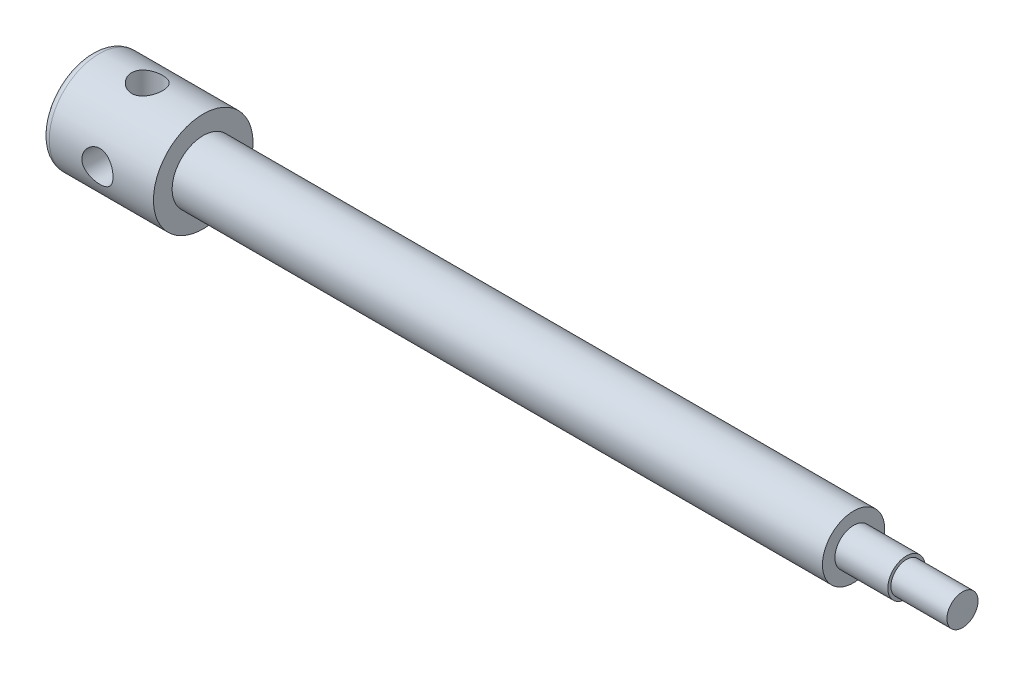
ISO-10303-21;
HEADER;
FILE_DESCRIPTION(('STEP AP214'),'2;1');
FILE_NAME('part.step','',(''),(''),'','','');
FILE_SCHEMA(('AUTOMOTIVE_DESIGN { 1 0 10303 214 1 1 1 1 }'));
ENDSEC;
DATA;
#1=APPLICATION_CONTEXT('core data for automotive mechanical design processes');
#2=APPLICATION_PROTOCOL_DEFINITION('international standard','automotive_design',2000,#1);
#3=PRODUCT_CONTEXT('',#1,'mechanical');
#4=PRODUCT('Part','Part','',(#3));
#5=PRODUCT_RELATED_PRODUCT_CATEGORY('part','',(#4));
#6=PRODUCT_DEFINITION_FORMATION('','',#4);
#7=PRODUCT_DEFINITION_CONTEXT('part definition',#1,'design');
#8=PRODUCT_DEFINITION('design','',#6,#7);
#9=PRODUCT_DEFINITION_SHAPE('','',#8);
#10=(LENGTH_UNIT() NAMED_UNIT(*) SI_UNIT(.MILLI.,.METRE.));
#11=(NAMED_UNIT(*) PLANE_ANGLE_UNIT() SI_UNIT($,.RADIAN.));
#12=(NAMED_UNIT(*) SI_UNIT($,.STERADIAN.) SOLID_ANGLE_UNIT());
#13=UNCERTAINTY_MEASURE_WITH_UNIT(LENGTH_MEASURE(1.E-05),#10,'distance_accuracy_value','');
#14=(GEOMETRIC_REPRESENTATION_CONTEXT(3) GLOBAL_UNCERTAINTY_ASSIGNED_CONTEXT((#13)) GLOBAL_UNIT_ASSIGNED_CONTEXT((#10,
#11,#12)) REPRESENTATION_CONTEXT('',''));
#15=CARTESIAN_POINT('',(0.,0.,0.));
#16=DIRECTION('',(0.,0.,1.));
#17=DIRECTION('',(1.,0.,0.));
#18=AXIS2_PLACEMENT_3D('',#15,#16,#17);
#19=CARTESIAN_POINT('',(-71.92624784853,0.,-20.));
#20=DIRECTION('',(0.,0.,1.));
#21=DIRECTION('',(1.,0.,0.));
#22=AXIS2_PLACEMENT_3D('',#19,#20,#21);
#23=CYLINDRICAL_SURFACE('',#22,5.);
#24=CARTESIAN_POINT('',(-66.92624784853,0.,16.));
#25=CARTESIAN_POINT('',(-66.9262496348803,-0.273756740698178,15.9999986351195));
#26=CARTESIAN_POINT('',(-66.9488047563077,-0.547532210011409,15.9929077993933));
#27=CARTESIAN_POINT('',(-67.038192814687,-1.08707683835382,15.9653157635526));
#28=CARTESIAN_POINT('',(-67.1050357739876,-1.35284417090373,15.9448115279957));
#29=CARTESIAN_POINT('',(-67.2805253333128,-1.86851417460312,15.892632627915));
#30=CARTESIAN_POINT('',(-67.3891072271413,-2.11844070794284,15.860975259956));
#31=CARTESIAN_POINT('',(-67.6447171192438,-2.59653920938621,15.7897587664487));
#32=CARTESIAN_POINT('',(-67.7917511756543,-2.82470774178094,15.7501983960149));
#33=CARTESIAN_POINT('',(-68.1248718165974,-3.25986133980768,15.6660085495921));
#34=CARTESIAN_POINT('',(-68.3119313887667,-3.46608011262119,15.621268637007));
#35=CARTESIAN_POINT('',(-68.7177214181918,-3.84478952815342,15.5324018550409));
#36=CARTESIAN_POINT('',(-68.9364577585365,-4.01727389161515,15.4882751012093));
#37=CARTESIAN_POINT('',(-69.4060261037373,-4.32777345930637,15.4044457876485));
#38=CARTESIAN_POINT('',(-69.6575177585377,-4.4648313659311,15.3648795310221));
#39=CARTESIAN_POINT('',(-70.1814171083526,-4.69438964299239,15.2963120709366));
#40=CARTESIAN_POINT('',(-70.4538192716734,-4.78690175085854,15.2673080849026));
#41=CARTESIAN_POINT('',(-71.0031601583637,-4.92193839721857,15.224304279618));
#42=CARTESIAN_POINT('',(-71.2797152230982,-4.96588440031619,15.2098789171452));
#43=CARTESIAN_POINT('',(-71.8366203241648,-5.00698220147794,15.1964022056731));
#44=CARTESIAN_POINT('',(-72.116969331791,-5.00414643984172,15.1973467694717));
#45=CARTESIAN_POINT('',(-72.6617456896411,-4.95287298929817,15.2141275626545));
#46=CARTESIAN_POINT('',(-72.9263643520819,-4.90624231472935,15.2293736684469));
#47=CARTESIAN_POINT('',(-73.443816474779,-4.77163253417961,15.272081024701));
#48=CARTESIAN_POINT('',(-73.6966486793883,-4.68364903377187,15.2995435733467));
#49=CARTESIAN_POINT('',(-74.1876556262284,-4.46755498726522,15.3640417609541));
#50=CARTESIAN_POINT('',(-74.4255622912893,-4.33887702648707,15.4012113865356));
#51=CARTESIAN_POINT('',(-74.8769989200551,-4.04544082951014,15.4808742631002));
#52=CARTESIAN_POINT('',(-75.0905225295472,-3.88067322086206,15.523368895754));
#53=CARTESIAN_POINT('',(-75.4973476221955,-3.51086781672959,15.6112611120491));
#54=CARTESIAN_POINT('',(-75.6892860796481,-3.30433828237157,15.6567027842357));
#55=CARTESIAN_POINT('',(-76.0361354228494,-2.86145763238184,15.7436628303753));
#56=CARTESIAN_POINT('',(-76.191043565407,-2.62510430939601,15.7851809135328));
#57=CARTESIAN_POINT('',(-76.4603586029349,-2.1266584418619,15.8600517956098));
#58=CARTESIAN_POINT('',(-76.5744403903858,-1.86437962767715,15.8933384259289));
#59=CARTESIAN_POINT('',(-76.7564598519363,-1.32307191113056,15.9475182331416));
#60=CARTESIAN_POINT('',(-76.8244115374836,-1.04404812289843,15.9684151730059));
#61=CARTESIAN_POINT('',(-76.9099200188459,-0.488740629161391,15.9948555758007));
#62=CARTESIAN_POINT('',(-76.9293220229041,-0.212767395155379,16.0009609158175));
#63=CARTESIAN_POINT('',(-76.9223829419807,0.338521222930341,15.9987919892393));
#64=CARTESIAN_POINT('',(-76.8960485392395,0.613836697226033,15.9905198232454));
#65=CARTESIAN_POINT('',(-76.7998654781044,1.14887733190339,15.9608945507905));
#66=CARTESIAN_POINT('',(-76.73111477808,1.40881991368374,15.9398717244275));
#67=CARTESIAN_POINT('',(-76.5533904390631,1.9134077154455,15.8872048551716));
#68=CARTESIAN_POINT('',(-76.4444118324299,2.15805104179623,15.8555595005738));
#69=CARTESIAN_POINT('',(-76.1863549823352,2.63172962668875,15.783941710377));
#70=CARTESIAN_POINT('',(-76.0363638985427,2.86023895915116,15.7437850727067));
#71=CARTESIAN_POINT('',(-75.7016350080603,3.28946340384103,15.6597364001372));
#72=CARTESIAN_POINT('',(-75.5168877775514,3.49017095217579,15.6158433539155));
#73=CARTESIAN_POINT('',(-75.1092122883216,3.86634985167607,15.5270797953257));
#74=CARTESIAN_POINT('',(-74.8850611935731,4.04050609358125,15.4822394682577));
#75=CARTESIAN_POINT('',(-74.4097413830229,4.34885000980606,15.3984778838242));
#76=CARTESIAN_POINT('',(-74.158573096422,4.48303831893719,15.3595565324524));
#77=CARTESIAN_POINT('',(-73.6368671570481,4.70680333922169,15.2924712932348));
#78=CARTESIAN_POINT('',(-73.3664092507871,4.7965527822405,15.264265854275));
#79=CARTESIAN_POINT('',(-72.8131578755355,4.92891577272361,15.2220468337724));
#80=CARTESIAN_POINT('',(-72.5303691431559,4.97154725655978,15.2080278520491));
#81=CARTESIAN_POINT('',(-71.9742314982083,5.00717624632503,15.1963317085551));
#82=CARTESIAN_POINT('',(-71.7010340331403,5.00233118486543,15.1979441840057));
#83=CARTESIAN_POINT('',(-71.1595495087622,4.94835272515336,15.2156036150361));
#84=CARTESIAN_POINT('',(-70.891262220983,4.89922139290049,15.2316498972642));
#85=CARTESIAN_POINT('',(-70.3710716901624,4.7595091965447,15.2758725673356));
#86=CARTESIAN_POINT('',(-70.1189860841565,4.66954569624033,15.3038679276103));
#87=CARTESIAN_POINT('',(-69.6332861943939,4.45120909339998,15.3687881701826));
#88=CARTESIAN_POINT('',(-69.3996756802163,4.32282817776947,15.4057148685869));
#89=CARTESIAN_POINT('',(-68.9476639667707,4.02542700053974,15.4861394813401));
#90=CARTESIAN_POINT('',(-68.730215330529,3.8550133409653,15.5298379569183));
#91=CARTESIAN_POINT('',(-68.326302536082,3.48083598561921,15.6179599528484));
#92=CARTESIAN_POINT('',(-68.1398466925657,3.27706336937757,15.6623836642662));
#93=CARTESIAN_POINT('',(-67.7971176950783,2.8339466512934,15.7486908780989));
#94=CARTESIAN_POINT('',(-67.6420289027302,2.59365829794955,15.7904440692269));
#95=CARTESIAN_POINT('',(-67.3746521879722,2.08911655205461,15.8650707718751));
#96=CARTESIAN_POINT('',(-67.2623474399626,1.8248726311818,15.8979477726329));
#97=CARTESIAN_POINT('',(-67.0918823780961,1.30299054149592,15.9488260293388));
#98=CARTESIAN_POINT('',(-67.0299483793086,1.04668134845019,15.9678496322456));
#99=CARTESIAN_POINT('',(-66.9471344086591,0.52691958176099,15.9934360136194));
#100=CARTESIAN_POINT('',(-66.926246129314,0.263468464558693,16.0000013135858));
#101=CARTESIAN_POINT('',(-66.92624784853,0.,16.));
#102=B_SPLINE_CURVE_WITH_KNOTS('',3,(#24,#25,#26,#27,#28,#29,#30,#31,#32,#33,#34,#35,#36,#37,
#38,#39,#40,#41,#42,#43,#44,#45,#46,#47,#48,#49,#50,#51,#52,#53,#54,#55,#56,#57,#58,#59,#60,#61,
#62,#63,#64,#65,#66,#67,#68,#69,#70,#71,#72,#73,#74,#75,#76,#77,#78,#79,#80,#81,#82,#83,#84,#85,
#86,#87,#88,#89,#90,#91,#92,#93,#94,#95,#96,#97,#98,#99,#100,#101),.UNSPECIFIED.,.T.,.F.,(4,2,2,
2,2,2,2,2,2,2,2,2,2,2,2,2,2,2,2,2,2,2,2,2,2,2,2,2,2,2,2,2,2,2,2,2,2,2,4),(0.,0.820301797730038,
1.64078929339627,2.46000991680974,3.27935968623356,4.12151288780634,4.96382269725105,
5.82695084991453,6.68985145121465,7.52676600672196,8.3634580118391,9.16707669695196,
9.97078079925602,10.7862257089153,11.6018826405078,12.4546698912775,13.3075202966256,
14.1670184276843,15.0262553798757,15.852302742023,16.678229426068,17.4836250690084,
18.2891202014735,19.1142529896272,19.9396098284639,20.7976711486191,21.655718839442,
22.5104046302277,23.3647649559871,24.1804881394267,24.9961732705188,25.7999165363423,
26.6038233736824,27.4391805607299,28.274761495409,29.1376267255319,30.0001522671289,
30.7897854665371,31.5792588309973),.UNSPECIFIED.);
#103=CARTESIAN_POINT('',(-66.92624784853,0.,16.));
#104=VERTEX_POINT('',#103);
#105=EDGE_CURVE('E64',#104,#104,#102,.T.);
#106=ORIENTED_EDGE('',*,*,#105,.F.);
#107=EDGE_LOOP('',(#106));
#108=FACE_BOUND('',#107,.T.);
#109=CARTESIAN_POINT('',(-71.92624784853,0.,0.));
#110=DIRECTION('',(0.,-0.707106781186547,0.707106781186547));
#111=DIRECTION('',(0.,0.707106781186547,0.707106781186547));
#112=AXIS2_PLACEMENT_3D('',#109,#110,#111);
#113=ELLIPSE('',#112,7.07106781186548,5.);
#114=CARTESIAN_POINT('',(-76.92624784853,0.,0.));
#115=VERTEX_POINT('',#114);
#116=CARTESIAN_POINT('',(-66.92624784853,0.,0.));
#117=VERTEX_POINT('',#116);
#118=EDGE_CURVE('E44',#115,#117,#113,.F.);
#119=ORIENTED_EDGE('',*,*,#118,.T.);
#120=CARTESIAN_POINT('',(-71.92624784853,0.,0.));
#121=DIRECTION('',(0.,0.707106781186547,0.707106781186547));
#122=DIRECTION('',(0.,-0.707106781186547,0.707106781186547));
#123=AXIS2_PLACEMENT_3D('',#120,#121,#122);
#124=ELLIPSE('',#123,7.07106781186548,5.);
#125=EDGE_CURVE('E11',#117,#115,#124,.F.);
#126=ORIENTED_EDGE('',*,*,#125,.T.);
#127=EDGE_LOOP('',(#119,#126));
#128=FACE_BOUND('',#127,.T.);
#129=ADVANCED_FACE('F31',(#108,#128),#23,.F.);
#130=CARTESIAN_POINT('',(-89.92624784853,0.,0.));
#131=DIRECTION('',(1.,0.,0.));
#132=DIRECTION('',(0.,0.,-1.));
#133=AXIS2_PLACEMENT_3D('',#130,#131,#132);
#134=PLANE('',#133);
#135=CARTESIAN_POINT('',(-89.92624784853,0.,0.));
#136=DIRECTION('',(-1.,0.,0.));
#137=DIRECTION('',(0.,0.,1.));
#138=AXIS2_PLACEMENT_3D('',#135,#136,#137);
#139=CIRCLE('',#138,13.5);
#140=CARTESIAN_POINT('',(-89.92624784853,0.,13.5));
#141=VERTEX_POINT('',#140);
#142=EDGE_CURVE('E59',#141,#141,#139,.T.);
#143=ORIENTED_EDGE('',*,*,#142,.T.);
#144=EDGE_LOOP('',(#143));
#145=FACE_BOUND('',#144,.T.);
#146=ADVANCED_FACE('F33',(#145),#134,.F.);
#147=CARTESIAN_POINT('',(-87.42624784853,0.,0.));
#148=DIRECTION('',(-1.,0.,0.));
#149=DIRECTION('',(0.,0.,1.));
#150=AXIS2_PLACEMENT_3D('',#147,#148,#149);
#151=TOROIDAL_SURFACE('',#150,13.5,2.50000000000001);
#152=ORIENTED_EDGE('',*,*,#142,.F.);
#153=EDGE_LOOP('',(#152));
#154=FACE_BOUND('',#153,.T.);
#155=CARTESIAN_POINT('',(-87.42624784853,0.,0.));
#156=DIRECTION('',(-1.,0.,0.));
#157=DIRECTION('',(0.,0.,1.));
#158=AXIS2_PLACEMENT_3D('',#155,#156,#157);
#159=CIRCLE('',#158,16.);
#160=CARTESIAN_POINT('',(-87.42624784853,0.,16.));
#161=VERTEX_POINT('',#160);
#162=EDGE_CURVE('E133',#161,#161,#159,.T.);
#163=ORIENTED_EDGE('',*,*,#162,.T.);
#164=EDGE_LOOP('',(#163));
#165=FACE_BOUND('',#164,.T.);
#166=ADVANCED_FACE('F114',(#154,#165),#151,.T.);
#167=CARTESIAN_POINT('',(0.,0.,0.));
#168=DIRECTION('',(-1.,0.,0.));
#169=DIRECTION('',(0.,0.,1.));
#170=AXIS2_PLACEMENT_3D('',#167,#168,#169);
#171=CYLINDRICAL_SURFACE('',#170,16.);
#172=CARTESIAN_POINT('',(-71.92624784853,-15.1986841535707,5.));
#173=CARTESIAN_POINT('',(-71.6528597040784,-15.1986858388479,4.99999815120853));
#174=CARTESIAN_POINT('',(-71.3794527737134,-15.206141260301,4.97750155166157));
#175=CARTESIAN_POINT('',(-70.8406712050226,-15.2350255598558,4.8883670160513));
#176=CARTESIAN_POINT('',(-70.5752987576024,-15.2564582140989,4.82171715130013));
#177=CARTESIAN_POINT('',(-70.060468240801,-15.3106375534649,4.64679152894284));
#178=CARTESIAN_POINT('',(-69.810982916107,-15.3433642077798,4.53858942946721));
#179=CARTESIAN_POINT('',(-69.3336370650742,-15.4164162487404,4.28387656692615));
#180=CARTESIAN_POINT('',(-69.1057803686896,-15.4567429774317,4.13735903622525));
#181=CARTESIAN_POINT('',(-68.670332378556,-15.5420051067468,3.80478428248921));
#182=CARTESIAN_POINT('',(-68.463593410786,-15.5870449353918,3.61763759888161));
#183=CARTESIAN_POINT('',(-68.0838637956932,-15.6757698344129,3.21144818582197));
#184=CARTESIAN_POINT('',(-67.9108778607506,-15.7194547149049,2.99240101007426));
#185=CARTESIAN_POINT('',(-67.599803596485,-15.8017421356033,2.52250364997345));
#186=CARTESIAN_POINT('',(-67.4625930332041,-15.8402073825112,2.27104622608038));
#187=CARTESIAN_POINT('',(-67.2327436491078,-15.9065020733207,1.74721693141361));
#188=CARTESIAN_POINT('',(-67.1400943519316,-15.9343340167968,1.47484999394821));
#189=CARTESIAN_POINT('',(-67.0048433361417,-15.9754870328345,0.925857427864398));
#190=CARTESIAN_POINT('',(-66.9607848493786,-15.9892295593657,0.649622861872868));
#191=CARTESIAN_POINT('',(-66.9193504627799,-16.0021438350407,0.0933632559380788));
#192=CARTESIAN_POINT('',(-66.9219639510947,-16.0013188964028,-0.186660907892346));
#193=CARTESIAN_POINT('',(-66.9728410148738,-15.9854846453013,-0.732297921418927));
#194=CARTESIAN_POINT('',(-67.019525382582,-15.9709660388855,-0.998074537256131));
#195=CARTESIAN_POINT('',(-67.1546278087021,-15.929979302435,-1.51781225339112));
#196=CARTESIAN_POINT('',(-67.2430485888765,-15.9035103930884,-1.77177258192494));
#197=CARTESIAN_POINT('',(-67.4601286048292,-15.8409383891783,-2.26431241261896));
#198=CARTESIAN_POINT('',(-67.589267082781,-15.8047213446668,-2.50266562249071));
#199=CARTESIAN_POINT('',(-67.8837322473493,-15.7264689181539,-2.95481004460873));
#200=CARTESIAN_POINT('',(-68.0490680850855,-15.6844320658262,-3.16859502483764));
#201=CARTESIAN_POINT('',(-68.4193423877308,-15.5969468293413,-3.57495079381314));
#202=CARTESIAN_POINT('',(-68.6256441238783,-15.5514292793937,-3.76626619636764));
#203=CARTESIAN_POINT('',(-69.0678282558442,-15.4636246177862,-4.11195897039057));
#204=CARTESIAN_POINT('',(-69.3037141308914,-15.4213378870279,-4.26633199104755));
#205=CARTESIAN_POINT('',(-69.8019177239203,-15.3444338653158,-4.53521860076338));
#206=CARTESIAN_POINT('',(-70.0645014844939,-15.3099076117639,-4.64926722799055));
#207=CARTESIAN_POINT('',(-70.606485815898,-15.253501811154,-4.83113383782183));
#208=CARTESIAN_POINT('',(-70.8858803053075,-15.2316177207005,-4.89896843060006));
#209=CARTESIAN_POINT('',(-71.4415276588385,-15.2039825362816,-4.9840594074562));
#210=CARTESIAN_POINT('',(-71.7174558334705,-15.1976186557503,-5.00323817415589));
#211=CARTESIAN_POINT('',(-72.2686068145105,-15.200043098397,-4.99586977992484));
#212=CARTESIAN_POINT('',(-72.5438297233287,-15.2088290802927,-4.96932968445627));
#213=CARTESIAN_POINT('',(-73.0774810351397,-15.2399582993567,-4.87299494052765));
#214=CARTESIAN_POINT('',(-73.3361649448268,-15.2619021640804,-4.80447324642202));
#215=CARTESIAN_POINT('',(-73.8383350165133,-15.3164514932552,-4.62761494644059));
#216=CARTESIAN_POINT('',(-74.0818186922145,-15.3490586964925,-4.51927184684605));
#217=CARTESIAN_POINT('',(-74.5544042876172,-15.4224215861294,-4.26230042623513));
#218=CARTESIAN_POINT('',(-74.7828935109011,-15.4633841395902,-4.11260589954234));
#219=CARTESIAN_POINT('',(-75.2122092339776,-15.5484139589123,-3.77842563471921));
#220=CARTESIAN_POINT('',(-75.4130285242313,-15.5924820294279,-3.59393085876313));
#221=CARTESIAN_POINT('',(-75.7898893121813,-15.6809675025074,-3.18629179101443));
#222=CARTESIAN_POINT('',(-75.9645589930895,-15.7253236914272,-2.96186259915408));
#223=CARTESIAN_POINT('',(-76.273812021815,-15.8075623937471,-2.48580618260558));
#224=CARTESIAN_POINT('',(-76.4083972057741,-15.8454452036378,-2.23418020443448));
#225=CARTESIAN_POINT('',(-76.6323700984167,-15.9102524771405,-1.71242209332732));
#226=CARTESIAN_POINT('',(-76.7220849999047,-15.937255982448,-1.44244073713502));
#227=CARTESIAN_POINT('',(-76.8545380028888,-15.9776097059431,-0.890229016225553));
#228=CARTESIAN_POINT('',(-76.8972908048639,-15.9909641965712,-0.608002513361415));
#229=CARTESIAN_POINT('',(-76.9334118555285,-16.0022321361783,-0.051939746595608));
#230=CARTESIAN_POINT('',(-76.9287616492131,-16.0007651762951,0.221756767786049));
#231=CARTESIAN_POINT('',(-76.8750006043352,-15.9840391232424,0.764292887693026));
#232=CARTESIAN_POINT('',(-76.825892664562,-15.9687809293064,1.03313280871841));
#233=CARTESIAN_POINT('',(-76.6858718116411,-15.9263828337902,1.55502047392303));
#234=CARTESIAN_POINT('',(-76.5954894171492,-15.899393918402,1.80822367379742));
#235=CARTESIAN_POINT('',(-76.3759645396954,-15.8363178235242,2.29599370200086));
#236=CARTESIAN_POINT('',(-76.2468154086338,-15.8002290836774,2.53055732509979));
#237=CARTESIAN_POINT('',(-75.9483568151548,-15.7211958753111,2.98304677987683));
#238=CARTESIAN_POINT('',(-75.777833758684,-15.6780603899479,3.20013842820514));
#239=CARTESIAN_POINT('',(-75.4036082907463,-15.590349461973,3.6032831656046));
#240=CARTESIAN_POINT('',(-75.1998959519356,-15.5457735917315,3.78932693404399));
#241=CARTESIAN_POINT('',(-74.7569849692002,-15.4584757027472,4.13131463642454));
#242=CARTESIAN_POINT('',(-74.5168342362006,-15.4158640332118,4.28605711968616));
#243=CARTESIAN_POINT('',(-74.0126553675799,-15.3392050100618,4.5528188298417));
#244=CARTESIAN_POINT('',(-73.7486369427427,-15.3051541945183,4.66485533612217));
#245=CARTESIAN_POINT('',(-73.2273573792551,-15.2522624175552,4.83484721745086));
#246=CARTESIAN_POINT('',(-72.9714376587741,-15.2323726005924,4.89659759350261));
#247=CARTESIAN_POINT('',(-72.4524325202143,-15.2055842579893,4.97916983261894));
#248=CARTESIAN_POINT('',(-72.1893488837477,-15.1986825317074,5.00000177922474));
#249=CARTESIAN_POINT('',(-71.92624784853,-15.1986841535707,5.));
#250=B_SPLINE_CURVE_WITH_KNOTS('',3,(#172,#173,#174,#175,#176,#177,#178,#179,#180,#181,#182,
#183,#184,#185,#186,#187,#188,#189,#190,#191,#192,#193,#194,#195,#196,#197,#198,#199,#200,#201,
#202,#203,#204,#205,#206,#207,#208,#209,#210,#211,#212,#213,#214,#215,#216,#217,#218,#219,#220,
#221,#222,#223,#224,#225,#226,#227,#228,#229,#230,#231,#232,#233,#234,#235,#236,#237,#238,#239,
#240,#241,#242,#243,#244,#245,#246,#247,#248,#249),.UNSPECIFIED.,.T.,.F.,(4,2,2,2,2,2,2,2,2,2,2,
2,2,2,2,2,2,2,2,2,2,2,2,2,2,2,2,2,2,2,2,2,2,2,2,2,2,2,4),(0.,0.819192550193962,1.63860650823894,
2.45657457647432,3.27468721969979,4.11828322203354,4.96199691764492,5.82479287854934,
6.68738589671688,7.52334891342135,8.35912185887099,9.16603931879003,9.97300940760373,
10.7898561843364,11.6069097085275,12.4580135574934,13.3092175941511,14.1699388374229,
15.0303505582074,15.8561973316147,16.6819164888609,17.4837588818718,18.2857320902257,
19.1107045324817,19.9358915205725,20.7952775125578,21.6546241327808,22.5076095717372,
23.3603279257207,24.1775520976783,24.9947229877896,25.8016738606877,26.6087631965634,
27.4432277243059,28.2779423109849,29.1403118201788,30.002332032282,30.7908941750129,
31.5792619677388),.UNSPECIFIED.);
#251=CARTESIAN_POINT('',(-71.92624784853,-15.1986841535707,5.));
#252=VERTEX_POINT('',#251);
#253=EDGE_CURVE('E243',#252,#252,#250,.T.);
#254=ORIENTED_EDGE('',*,*,#253,.T.);
#255=EDGE_LOOP('',(#254));
#256=FACE_BOUND('',#255,.T.);
#257=CARTESIAN_POINT('',(-71.92624784853,15.1986841535707,5.));
#258=CARTESIAN_POINT('',(-72.1996359929815,15.1986858388479,4.99999815120853));
#259=CARTESIAN_POINT('',(-72.4730429233466,15.206141260301,4.97750155166157));
#260=CARTESIAN_POINT('',(-73.0118244920374,15.2350255598558,4.8883670160513));
#261=CARTESIAN_POINT('',(-73.2771969394576,15.2564582140989,4.82171715130013));
#262=CARTESIAN_POINT('',(-73.792027456259,15.3106375534649,4.64679152894284));
#263=CARTESIAN_POINT('',(-74.041512780953,15.3433642077798,4.53858942946721));
#264=CARTESIAN_POINT('',(-74.5188586319858,15.4164162487404,4.28387656692615));
#265=CARTESIAN_POINT('',(-74.7467153283704,15.4567429774317,4.13735903622525));
#266=CARTESIAN_POINT('',(-75.182163318504,15.5420051067468,3.80478428248921));
#267=CARTESIAN_POINT('',(-75.3889022862739,15.5870449353918,3.61763759888161));
#268=CARTESIAN_POINT('',(-75.7686319013667,15.6757698344129,3.21144818582197));
#269=CARTESIAN_POINT('',(-75.9416178363094,15.7194547149049,2.99240101007426));
#270=CARTESIAN_POINT('',(-76.252692100575,15.8017421356033,2.52250364997345));
#271=CARTESIAN_POINT('',(-76.3899026638558,15.8402073825112,2.27104622608038));
#272=CARTESIAN_POINT('',(-76.6197520479522,15.9065020733207,1.74721693141362));
#273=CARTESIAN_POINT('',(-76.7124013451283,15.9343340167968,1.47484999394821));
#274=CARTESIAN_POINT('',(-76.8476523609183,15.9754870328345,0.925857427864399));
#275=CARTESIAN_POINT('',(-76.8917108476814,15.9892295593657,0.64962286187287));
#276=CARTESIAN_POINT('',(-76.9331452342801,16.0021438350407,0.0933632559380811));
#277=CARTESIAN_POINT('',(-76.9305317459653,16.0013188964028,-0.186660907892345));
#278=CARTESIAN_POINT('',(-76.8796546821862,15.9854846453013,-0.732297921418927));
#279=CARTESIAN_POINT('',(-76.832970314478,15.9709660388855,-0.998074537256131));
#280=CARTESIAN_POINT('',(-76.6978678883579,15.929979302435,-1.51781225339112));
#281=CARTESIAN_POINT('',(-76.6094471081835,15.9035103930884,-1.77177258192494));
#282=CARTESIAN_POINT('',(-76.3923670922308,15.8409383891783,-2.26431241261896));
#283=CARTESIAN_POINT('',(-76.263228614279,15.8047213446668,-2.50266562249071));
#284=CARTESIAN_POINT('',(-75.9687634497106,15.7264689181539,-2.95481004460873));
#285=CARTESIAN_POINT('',(-75.8034276119745,15.6844320658262,-3.16859502483764));
#286=CARTESIAN_POINT('',(-75.4331533093291,15.5969468293413,-3.57495079381314));
#287=CARTESIAN_POINT('',(-75.2268515731816,15.5514292793937,-3.76626619636765));
#288=CARTESIAN_POINT('',(-74.7846674412157,15.4636246177862,-4.11195897039057));
#289=CARTESIAN_POINT('',(-74.5487815661686,15.4213378870279,-4.26633199104755));
#290=CARTESIAN_POINT('',(-74.0505779731397,15.3444338653158,-4.53521860076338));
#291=CARTESIAN_POINT('',(-73.7879942125661,15.3099076117639,-4.64926722799055));
#292=CARTESIAN_POINT('',(-73.246009881162,15.253501811154,-4.83113383782183));
#293=CARTESIAN_POINT('',(-72.9666153917525,15.2316177207005,-4.89896843060006));
#294=CARTESIAN_POINT('',(-72.4109680382214,15.2039825362816,-4.9840594074562));
#295=CARTESIAN_POINT('',(-72.1350398635894,15.1976186557503,-5.00323817415589));
#296=CARTESIAN_POINT('',(-71.5838888825494,15.200043098397,-4.99586977992484));
#297=CARTESIAN_POINT('',(-71.3086659737313,15.2088290802927,-4.96932968445627));
#298=CARTESIAN_POINT('',(-70.7750146619203,15.2399582993567,-4.87299494052765));
#299=CARTESIAN_POINT('',(-70.5163307522332,15.2619021640804,-4.80447324642202));
#300=CARTESIAN_POINT('',(-70.0141606805466,15.3164514932552,-4.62761494644059));
#301=CARTESIAN_POINT('',(-69.7706770048455,15.3490586964925,-4.51927184684605));
#302=CARTESIAN_POINT('',(-69.2980914094427,15.4224215861294,-4.26230042623513));
#303=CARTESIAN_POINT('',(-69.0696021861588,15.4633841395902,-4.11260589954233));
#304=CARTESIAN_POINT('',(-68.6402864630824,15.5484139589123,-3.77842563471921));
#305=CARTESIAN_POINT('',(-68.4394671728286,15.5924820294279,-3.59393085876312));
#306=CARTESIAN_POINT('',(-68.0626063848787,15.6809675025074,-3.18629179101443));
#307=CARTESIAN_POINT('',(-67.8879367039705,15.7253236914272,-2.96186259915408));
#308=CARTESIAN_POINT('',(-67.5786836752449,15.8075623937471,-2.48580618260558));
#309=CARTESIAN_POINT('',(-67.4440984912858,15.8454452036378,-2.23418020443448));
#310=CARTESIAN_POINT('',(-67.2201255986432,15.9102524771405,-1.71242209332732));
#311=CARTESIAN_POINT('',(-67.1304106971552,15.937255982448,-1.44244073713502));
#312=CARTESIAN_POINT('',(-66.9979576941711,15.9776097059431,-0.890229016225556));
#313=CARTESIAN_POINT('',(-66.955204892196,15.9909641965712,-0.608002513361416));
#314=CARTESIAN_POINT('',(-66.9190838415315,16.0022321361783,-0.0519397465956069));
#315=CARTESIAN_POINT('',(-66.9237340478469,16.0007651762951,0.221756767786051));
#316=CARTESIAN_POINT('',(-66.9774950927248,15.9840391232424,0.764292887693028));
#317=CARTESIAN_POINT('',(-67.026603032498,15.9687809293064,1.03313280871841));
#318=CARTESIAN_POINT('',(-67.1666238854189,15.9263828337902,1.55502047392303));
#319=CARTESIAN_POINT('',(-67.2570062799108,15.899393918402,1.80822367379743));
#320=CARTESIAN_POINT('',(-67.4765311573646,15.8363178235242,2.29599370200087));
#321=CARTESIAN_POINT('',(-67.6056802884262,15.8002290836774,2.5305573250998));
#322=CARTESIAN_POINT('',(-67.9041388819051,15.7211958753111,2.98304677987683));
#323=CARTESIAN_POINT('',(-68.074661938376,15.6780603899479,3.20013842820513));
#324=CARTESIAN_POINT('',(-68.4488874063137,15.590349461973,3.6032831656046));
#325=CARTESIAN_POINT('',(-68.6525997451244,15.5457735917315,3.78932693404399));
#326=CARTESIAN_POINT('',(-69.0955107278598,15.4584757027472,4.13131463642454));
#327=CARTESIAN_POINT('',(-69.3356614608594,15.4158640332118,4.28605711968617));
#328=CARTESIAN_POINT('',(-69.83984032948,15.3392050100618,4.5528188298417));
#329=CARTESIAN_POINT('',(-70.1038587543173,15.3051541945183,4.66485533612217));
#330=CARTESIAN_POINT('',(-70.6251383178048,15.2522624175552,4.83484721745086));
#331=CARTESIAN_POINT('',(-70.8810580382859,15.2323726005924,4.89659759350261));
#332=CARTESIAN_POINT('',(-71.4000631768456,15.2055842579893,4.97916983261894));
#333=CARTESIAN_POINT('',(-71.6631468133122,15.1986825317074,5.00000177922474));
#334=CARTESIAN_POINT('',(-71.92624784853,15.1986841535707,5.));
#335=B_SPLINE_CURVE_WITH_KNOTS('',3,(#257,#258,#259,#260,#261,#262,#263,#264,#265,#266,#267,
#268,#269,#270,#271,#272,#273,#274,#275,#276,#277,#278,#279,#280,#281,#282,#283,#284,#285,#286,
#287,#288,#289,#290,#291,#292,#293,#294,#295,#296,#297,#298,#299,#300,#301,#302,#303,#304,#305,
#306,#307,#308,#309,#310,#311,#312,#313,#314,#315,#316,#317,#318,#319,#320,#321,#322,#323,#324,
#325,#326,#327,#328,#329,#330,#331,#332,#333,#334),.UNSPECIFIED.,.T.,.F.,(4,2,2,2,2,2,2,2,2,2,2,
2,2,2,2,2,2,2,2,2,2,2,2,2,2,2,2,2,2,2,2,2,2,2,2,2,2,2,4),(0.,0.819192550193962,1.63860650823894,
2.45657457647432,3.27468721969979,4.11828322203354,4.96199691764492,5.82479287854933,
6.68738589671688,7.52334891342135,8.35912185887099,9.16603931879003,9.97300940760373,
10.7898561843364,11.6069097085275,12.4580135574934,13.3092175941511,14.1699388374229,
15.0303505582074,15.8561973316147,16.6819164888609,17.4837588818718,18.2857320902257,
19.1107045324817,19.9358915205725,20.7952775125578,21.6546241327808,22.5076095717372,
23.3603279257207,24.1775520976783,24.9947229877896,25.8016738606877,26.6087631965634,
27.4432277243059,28.2779423109849,29.1403118201788,30.002332032282,30.7908941750129,
31.5792619677388),.UNSPECIFIED.);
#336=CARTESIAN_POINT('',(-71.92624784853,15.1986841535707,5.));
#337=VERTEX_POINT('',#336);
#338=EDGE_CURVE('E248',#337,#337,#335,.T.);
#339=ORIENTED_EDGE('',*,*,#338,.T.);
#340=EDGE_LOOP('',(#339));
#341=FACE_BOUND('',#340,.T.);
#342=ORIENTED_EDGE('',*,*,#105,.T.);
#343=EDGE_LOOP('',(#342));
#344=FACE_BOUND('',#343,.T.);
#345=CARTESIAN_POINT('',(-66.92624784853,0.,-16.));
#346=CARTESIAN_POINT('',(-66.9262496348803,0.273756740698178,-15.9999986351195));
#347=CARTESIAN_POINT('',(-66.9488047563077,0.547532210011409,-15.9929077993933));
#348=CARTESIAN_POINT('',(-67.038192814687,1.08707683835382,-15.9653157635526));
#349=CARTESIAN_POINT('',(-67.1050357739876,1.35284417090373,-15.9448115279957));
#350=CARTESIAN_POINT('',(-67.2805253333128,1.86851417460312,-15.892632627915));
#351=CARTESIAN_POINT('',(-67.3891072271413,2.11844070794284,-15.860975259956));
#352=CARTESIAN_POINT('',(-67.6447171192438,2.59653920938621,-15.7897587664487));
#353=CARTESIAN_POINT('',(-67.7917511756543,2.82470774178094,-15.7501983960149));
#354=CARTESIAN_POINT('',(-68.1248718165974,3.25986133980768,-15.6660085495921));
#355=CARTESIAN_POINT('',(-68.3119313887667,3.46608011262119,-15.621268637007));
#356=CARTESIAN_POINT('',(-68.7177214181918,3.84478952815342,-15.5324018550409));
#357=CARTESIAN_POINT('',(-68.9364577585365,4.01727389161515,-15.4882751012093));
#358=CARTESIAN_POINT('',(-69.4060261037373,4.32777345930637,-15.4044457876485));
#359=CARTESIAN_POINT('',(-69.6575177585377,4.4648313659311,-15.3648795310221));
#360=CARTESIAN_POINT('',(-70.1814171083526,4.69438964299239,-15.2963120709366));
#361=CARTESIAN_POINT('',(-70.4538192716734,4.78690175085854,-15.2673080849026));
#362=CARTESIAN_POINT('',(-71.0031601583637,4.92193839721857,-15.224304279618));
#363=CARTESIAN_POINT('',(-71.2797152230982,4.96588440031619,-15.2098789171452));
#364=CARTESIAN_POINT('',(-71.8366203241648,5.00698220147794,-15.1964022056731));
#365=CARTESIAN_POINT('',(-72.116969331791,5.00414643984172,-15.1973467694717));
#366=CARTESIAN_POINT('',(-72.6617456896411,4.95287298929817,-15.2141275626545));
#367=CARTESIAN_POINT('',(-72.9263643520819,4.90624231472935,-15.2293736684469));
#368=CARTESIAN_POINT('',(-73.443816474779,4.77163253417961,-15.272081024701));
#369=CARTESIAN_POINT('',(-73.6966486793883,4.68364903377187,-15.2995435733467));
#370=CARTESIAN_POINT('',(-74.1876556262284,4.46755498726522,-15.3640417609541));
#371=CARTESIAN_POINT('',(-74.4255622912893,4.33887702648707,-15.4012113865356));
#372=CARTESIAN_POINT('',(-74.8769989200551,4.04544082951014,-15.4808742631002));
#373=CARTESIAN_POINT('',(-75.0905225295472,3.88067322086206,-15.523368895754));
#374=CARTESIAN_POINT('',(-75.4973476221955,3.51086781672959,-15.6112611120491));
#375=CARTESIAN_POINT('',(-75.6892860796481,3.30433828237157,-15.6567027842357));
#376=CARTESIAN_POINT('',(-76.0361354228494,2.86145763238184,-15.7436628303753));
#377=CARTESIAN_POINT('',(-76.191043565407,2.62510430939601,-15.7851809135328));
#378=CARTESIAN_POINT('',(-76.4603586029349,2.1266584418619,-15.8600517956098));
#379=CARTESIAN_POINT('',(-76.5744403903858,1.86437962767715,-15.8933384259289));
#380=CARTESIAN_POINT('',(-76.7564598519363,1.32307191113056,-15.9475182331416));
#381=CARTESIAN_POINT('',(-76.8244115374836,1.04404812289843,-15.9684151730059));
#382=CARTESIAN_POINT('',(-76.9099200188459,0.488740629161391,-15.9948555758007));
#383=CARTESIAN_POINT('',(-76.9293220229041,0.212767395155379,-16.0009609158175));
#384=CARTESIAN_POINT('',(-76.9223829419807,-0.338521222930341,-15.9987919892393));
#385=CARTESIAN_POINT('',(-76.8960485392395,-0.613836697226033,-15.9905198232454));
#386=CARTESIAN_POINT('',(-76.7998654781044,-1.14887733190339,-15.9608945507905));
#387=CARTESIAN_POINT('',(-76.73111477808,-1.40881991368374,-15.9398717244275));
#388=CARTESIAN_POINT('',(-76.5533904390631,-1.9134077154455,-15.8872048551716));
#389=CARTESIAN_POINT('',(-76.4444118324299,-2.15805104179623,-15.8555595005738));
#390=CARTESIAN_POINT('',(-76.1863549823352,-2.63172962668875,-15.783941710377));
#391=CARTESIAN_POINT('',(-76.0363638985427,-2.86023895915116,-15.7437850727067));
#392=CARTESIAN_POINT('',(-75.7016350080603,-3.28946340384103,-15.6597364001372));
#393=CARTESIAN_POINT('',(-75.5168877775514,-3.49017095217579,-15.6158433539155));
#394=CARTESIAN_POINT('',(-75.1092122883216,-3.86634985167607,-15.5270797953257));
#395=CARTESIAN_POINT('',(-74.8850611935731,-4.04050609358125,-15.4822394682577));
#396=CARTESIAN_POINT('',(-74.4097413830229,-4.34885000980606,-15.3984778838242));
#397=CARTESIAN_POINT('',(-74.158573096422,-4.48303831893719,-15.3595565324524));
#398=CARTESIAN_POINT('',(-73.6368671570481,-4.70680333922169,-15.2924712932348));
#399=CARTESIAN_POINT('',(-73.3664092507871,-4.7965527822405,-15.264265854275));
#400=CARTESIAN_POINT('',(-72.8131578755355,-4.92891577272361,-15.2220468337724));
#401=CARTESIAN_POINT('',(-72.5303691431559,-4.97154725655978,-15.2080278520491));
#402=CARTESIAN_POINT('',(-71.9742314982083,-5.00717624632503,-15.1963317085551));
#403=CARTESIAN_POINT('',(-71.7010340331403,-5.00233118486543,-15.1979441840057));
#404=CARTESIAN_POINT('',(-71.1595495087622,-4.94835272515336,-15.2156036150361));
#405=CARTESIAN_POINT('',(-70.891262220983,-4.89922139290049,-15.2316498972642));
#406=CARTESIAN_POINT('',(-70.3710716901624,-4.7595091965447,-15.2758725673356));
#407=CARTESIAN_POINT('',(-70.1189860841565,-4.66954569624033,-15.3038679276103));
#408=CARTESIAN_POINT('',(-69.6332861943939,-4.45120909339998,-15.3687881701826));
#409=CARTESIAN_POINT('',(-69.3996756802163,-4.32282817776947,-15.4057148685869));
#410=CARTESIAN_POINT('',(-68.9476639667707,-4.02542700053974,-15.4861394813401));
#411=CARTESIAN_POINT('',(-68.730215330529,-3.8550133409653,-15.5298379569183));
#412=CARTESIAN_POINT('',(-68.326302536082,-3.48083598561921,-15.6179599528484));
#413=CARTESIAN_POINT('',(-68.1398466925657,-3.27706336937757,-15.6623836642662));
#414=CARTESIAN_POINT('',(-67.7971176950783,-2.8339466512934,-15.7486908780989));
#415=CARTESIAN_POINT('',(-67.6420289027302,-2.59365829794955,-15.7904440692269));
#416=CARTESIAN_POINT('',(-67.3746521879722,-2.08911655205461,-15.8650707718751));
#417=CARTESIAN_POINT('',(-67.2623474399626,-1.8248726311818,-15.8979477726329));
#418=CARTESIAN_POINT('',(-67.0918823780961,-1.30299054149592,-15.9488260293388));
#419=CARTESIAN_POINT('',(-67.0299483793086,-1.04668134845019,-15.9678496322456));
#420=CARTESIAN_POINT('',(-66.9471344086591,-0.52691958176099,-15.9934360136194));
#421=CARTESIAN_POINT('',(-66.926246129314,-0.263468464558693,-16.0000013135858));
#422=CARTESIAN_POINT('',(-66.92624784853,0.,-16.));
#423=B_SPLINE_CURVE_WITH_KNOTS('',3,(#345,#346,#347,#348,#349,#350,#351,#352,#353,#354,#355,
#356,#357,#358,#359,#360,#361,#362,#363,#364,#365,#366,#367,#368,#369,#370,#371,#372,#373,#374,
#375,#376,#377,#378,#379,#380,#381,#382,#383,#384,#385,#386,#387,#388,#389,#390,#391,#392,#393,
#394,#395,#396,#397,#398,#399,#400,#401,#402,#403,#404,#405,#406,#407,#408,#409,#410,#411,#412,
#413,#414,#415,#416,#417,#418,#419,#420,#421,#422),.UNSPECIFIED.,.T.,.F.,(4,2,2,2,2,2,2,2,2,2,2,
2,2,2,2,2,2,2,2,2,2,2,2,2,2,2,2,2,2,2,2,2,2,2,2,2,2,2,4),(0.,0.820301797730038,1.64078929339627,
2.46000991680974,3.27935968623356,4.12151288780634,4.96382269725105,5.82695084991453,
6.68985145121465,7.52676600672196,8.3634580118391,9.16707669695196,9.97078079925602,
10.7862257089153,11.6018826405078,12.4546698912775,13.3075202966256,14.1670184276843,
15.0262553798757,15.852302742023,16.678229426068,17.4836250690084,18.2891202014735,
19.1142529896272,19.9396098284639,20.7976711486191,21.655718839442,22.5104046302277,
23.3647649559871,24.1804881394267,24.9961732705188,25.7999165363423,26.6038233736824,
27.4391805607299,28.274761495409,29.1376267255319,30.0001522671289,30.7897854665371,
31.5792588309973),.UNSPECIFIED.);
#424=CARTESIAN_POINT('',(-66.92624784853,0.,-16.));
#425=VERTEX_POINT('',#424);
#426=EDGE_CURVE('E72',#425,#425,#423,.T.);
#427=ORIENTED_EDGE('',*,*,#426,.T.);
#428=EDGE_LOOP('',(#427));
#429=FACE_BOUND('',#428,.T.);
#430=ORIENTED_EDGE('',*,*,#162,.F.);
#431=EDGE_LOOP('',(#430));
#432=FACE_BOUND('',#431,.T.);
#433=CARTESIAN_POINT('',(-53.92624784853,0.,0.));
#434=DIRECTION('',(-1.,0.,0.));
#435=DIRECTION('',(0.,0.,1.));
#436=AXIS2_PLACEMENT_3D('',#433,#434,#435);
#437=CIRCLE('',#436,16.);
#438=CARTESIAN_POINT('',(-53.92624784853,0.,16.));
#439=VERTEX_POINT('',#438);
#440=EDGE_CURVE('E135',#439,#439,#437,.T.);
#441=ORIENTED_EDGE('',*,*,#440,.T.);
#442=EDGE_LOOP('',(#441));
#443=FACE_BOUND('',#442,.T.);
#444=ADVANCED_FACE('F76',(#256,#341,#344,#429,#432,#443),#171,.T.);
#445=CARTESIAN_POINT('',(-53.92624784853,16.,0.));
#446=DIRECTION('',(-1.,0.,0.));
#447=DIRECTION('',(0.,0.,1.));
#448=AXIS2_PLACEMENT_3D('',#445,#446,#447);
#449=PLANE('',#448);
#450=ORIENTED_EDGE('',*,*,#440,.F.);
#451=EDGE_LOOP('',(#450));
#452=FACE_BOUND('',#451,.T.);
#453=CARTESIAN_POINT('',(-53.92624784853,0.,0.));
#454=DIRECTION('',(-1.,0.,0.));
#455=DIRECTION('',(0.,0.,1.));
#456=AXIS2_PLACEMENT_3D('',#453,#454,#455);
#457=CIRCLE('',#456,10.);
#458=CARTESIAN_POINT('',(-53.92624784853,0.,10.));
#459=VERTEX_POINT('',#458);
#460=EDGE_CURVE('E136',#459,#459,#457,.T.);
#461=ORIENTED_EDGE('',*,*,#460,.T.);
#462=EDGE_LOOP('',(#461));
#463=FACE_BOUND('',#462,.T.);
#464=ADVANCED_FACE('F107',(#452,#463),#449,.F.);
#465=CARTESIAN_POINT('',(0.,0.,0.));
#466=DIRECTION('',(-1.,0.,0.));
#467=DIRECTION('',(0.,0.,1.));
#468=AXIS2_PLACEMENT_3D('',#465,#466,#467);
#469=CYLINDRICAL_SURFACE('',#468,10.);
#470=ORIENTED_EDGE('',*,*,#460,.F.);
#471=EDGE_LOOP('',(#470));
#472=FACE_BOUND('',#471,.T.);
#473=CARTESIAN_POINT('',(155.07375215147,0.,0.));
#474=DIRECTION('',(-1.,0.,0.));
#475=DIRECTION('',(0.,0.,1.));
#476=AXIS2_PLACEMENT_3D('',#473,#474,#475);
#477=CIRCLE('',#476,10.);
#478=CARTESIAN_POINT('',(155.07375215147,0.,10.));
#479=VERTEX_POINT('',#478);
#480=EDGE_CURVE('E140',#479,#479,#477,.T.);
#481=ORIENTED_EDGE('',*,*,#480,.T.);
#482=EDGE_LOOP('',(#481));
#483=FACE_BOUND('',#482,.T.);
#484=ADVANCED_FACE('F104',(#472,#483),#469,.T.);
#485=CARTESIAN_POINT('',(155.07375215147,10.,0.));
#486=DIRECTION('',(-1.,0.,0.));
#487=DIRECTION('',(0.,0.,1.));
#488=AXIS2_PLACEMENT_3D('',#485,#486,#487);
#489=PLANE('',#488);
#490=ORIENTED_EDGE('',*,*,#480,.F.);
#491=EDGE_LOOP('',(#490));
#492=FACE_BOUND('',#491,.T.);
#493=CARTESIAN_POINT('',(155.07375215147,0.,0.));
#494=DIRECTION('',(-1.,0.,0.));
#495=DIRECTION('',(0.,0.,1.));
#496=AXIS2_PLACEMENT_3D('',#493,#494,#495);
#497=CIRCLE('',#496,6.);
#498=CARTESIAN_POINT('',(155.07375215147,0.,6.));
#499=VERTEX_POINT('',#498);
#500=EDGE_CURVE('E232',#499,#499,#497,.T.);
#501=ORIENTED_EDGE('',*,*,#500,.T.);
#502=EDGE_LOOP('',(#501));
#503=FACE_BOUND('',#502,.T.);
#504=ADVANCED_FACE('F100',(#492,#503),#489,.F.);
#505=CARTESIAN_POINT('',(0.,0.,0.));
#506=DIRECTION('',(-1.,0.,0.));
#507=DIRECTION('',(0.,0.,1.));
#508=AXIS2_PLACEMENT_3D('',#505,#506,#507);
#509=CYLINDRICAL_SURFACE('',#508,6.);
#510=ORIENTED_EDGE('',*,*,#500,.F.);
#511=EDGE_LOOP('',(#510));
#512=FACE_BOUND('',#511,.T.);
#513=CARTESIAN_POINT('',(172.07375215147,0.,0.));
#514=DIRECTION('',(-1.,0.,0.));
#515=DIRECTION('',(0.,0.,1.));
#516=AXIS2_PLACEMENT_3D('',#513,#514,#515);
#517=CIRCLE('',#516,6.);
#518=CARTESIAN_POINT('',(172.07375215147,0.,6.));
#519=VERTEX_POINT('',#518);
#520=EDGE_CURVE('E235',#519,#519,#517,.T.);
#521=ORIENTED_EDGE('',*,*,#520,.T.);
#522=EDGE_LOOP('',(#521));
#523=FACE_BOUND('',#522,.T.);
#524=ADVANCED_FACE('F96',(#512,#523),#509,.T.);
#525=CARTESIAN_POINT('',(172.07375215147,6.,0.));
#526=DIRECTION('',(-1.,0.,0.));
#527=DIRECTION('',(0.,0.,1.));
#528=AXIS2_PLACEMENT_3D('',#525,#526,#527);
#529=PLANE('',#528);
#530=ORIENTED_EDGE('',*,*,#520,.F.);
#531=EDGE_LOOP('',(#530));
#532=FACE_BOUND('',#531,.T.);
#533=CARTESIAN_POINT('',(172.07375215147,0.,0.));
#534=DIRECTION('',(-1.,0.,0.));
#535=DIRECTION('',(0.,0.,1.));
#536=AXIS2_PLACEMENT_3D('',#533,#534,#535);
#537=CIRCLE('',#536,5.);
#538=CARTESIAN_POINT('',(172.07375215147,0.,5.));
#539=VERTEX_POINT('',#538);
#540=EDGE_CURVE('E238',#539,#539,#537,.T.);
#541=ORIENTED_EDGE('',*,*,#540,.T.);
#542=EDGE_LOOP('',(#541));
#543=FACE_BOUND('',#542,.T.);
#544=ADVANCED_FACE('F92',(#532,#543),#529,.F.);
#545=CARTESIAN_POINT('',(0.,0.,0.));
#546=DIRECTION('',(-1.,0.,0.));
#547=DIRECTION('',(0.,0.,1.));
#548=AXIS2_PLACEMENT_3D('',#545,#546,#547);
#549=CYLINDRICAL_SURFACE('',#548,5.);
#550=ORIENTED_EDGE('',*,*,#540,.F.);
#551=EDGE_LOOP('',(#550));
#552=FACE_BOUND('',#551,.T.);
#553=CARTESIAN_POINT('',(190.07375215147,0.,0.));
#554=DIRECTION('',(-1.,0.,0.));
#555=DIRECTION('',(0.,0.,1.));
#556=AXIS2_PLACEMENT_3D('',#553,#554,#555);
#557=CIRCLE('',#556,5.);
#558=CARTESIAN_POINT('',(190.07375215147,0.,5.));
#559=VERTEX_POINT('',#558);
#560=EDGE_CURVE('E71',#559,#559,#557,.T.);
#561=ORIENTED_EDGE('',*,*,#560,.T.);
#562=EDGE_LOOP('',(#561));
#563=FACE_BOUND('',#562,.T.);
#564=ADVANCED_FACE('F88',(#552,#563),#549,.T.);
#565=CARTESIAN_POINT('',(190.07375215147,5.,0.));
#566=DIRECTION('',(-1.,0.,0.));
#567=DIRECTION('',(0.,0.,1.));
#568=AXIS2_PLACEMENT_3D('',#565,#566,#567);
#569=PLANE('',#568);
#570=ORIENTED_EDGE('',*,*,#560,.F.);
#571=EDGE_LOOP('',(#570));
#572=FACE_BOUND('',#571,.T.);
#573=ADVANCED_FACE('F83',(#572),#569,.F.);
#574=CARTESIAN_POINT('',(-71.92624784853,0.,0.));
#575=DIRECTION('',(0.,-0.707106781186547,0.707106781186547));
#576=DIRECTION('',(0.,0.707106781186547,0.707106781186547));
#577=AXIS2_PLACEMENT_3D('',#574,#575,#576);
#578=ELLIPSE('',#577,7.07106781186548,5.);
#579=EDGE_CURVE('E50',#115,#117,#578,.T.);
#580=ORIENTED_EDGE('',*,*,#579,.T.);
#581=CARTESIAN_POINT('',(-71.92624784853,0.,0.));
#582=DIRECTION('',(0.,0.707106781186547,0.707106781186547));
#583=DIRECTION('',(0.,-0.707106781186547,0.707106781186547));
#584=AXIS2_PLACEMENT_3D('',#581,#582,#583);
#585=ELLIPSE('',#584,7.07106781186548,5.);
#586=EDGE_CURVE('E39',#117,#115,#585,.T.);
#587=ORIENTED_EDGE('',*,*,#586,.T.);
#588=EDGE_LOOP('',(#580,#587));
#589=FACE_BOUND('',#588,.T.);
#590=ORIENTED_EDGE('',*,*,#426,.F.);
#591=EDGE_LOOP('',(#590));
#592=FACE_BOUND('',#591,.T.);
#593=ADVANCED_FACE('F61',(#589,#592),#23,.F.);
#594=CARTESIAN_POINT('',(-71.92624784853,-20.,0.));
#595=DIRECTION('',(0.,1.,0.));
#596=DIRECTION('',(0.,0.,1.));
#597=AXIS2_PLACEMENT_3D('',#594,#595,#596);
#598=CYLINDRICAL_SURFACE('',#597,5.);
#599=ORIENTED_EDGE('',*,*,#118,.F.);
#600=ORIENTED_EDGE('',*,*,#586,.F.);
#601=EDGE_LOOP('',(#599,#600));
#602=FACE_BOUND('',#601,.T.);
#603=ORIENTED_EDGE('',*,*,#338,.F.);
#604=EDGE_LOOP('',(#603));
#605=FACE_BOUND('',#604,.T.);
#606=ADVANCED_FACE('F57',(#602,#605),#598,.F.);
#607=ORIENTED_EDGE('',*,*,#579,.F.);
#608=ORIENTED_EDGE('',*,*,#125,.F.);
#609=EDGE_LOOP('',(#607,#608));
#610=FACE_BOUND('',#609,.T.);
#611=ORIENTED_EDGE('',*,*,#253,.F.);
#612=EDGE_LOOP('',(#611));
#613=FACE_BOUND('',#612,.T.);
#614=ADVANCED_FACE('F51',(#610,#613),#598,.F.);
#615=CLOSED_SHELL('',(#129,#146,#166,#444,#464,#484,#504,#524,#544,#564,#573,#593,#606,#614));
#616=MANIFOLD_SOLID_BREP('B2',#615);
#617=ADVANCED_BREP_SHAPE_REPRESENTATION('',(#18,#616),#14);
#618=SHAPE_DEFINITION_REPRESENTATION(#9,#617);
ENDSEC;
END-ISO-10303-21;
